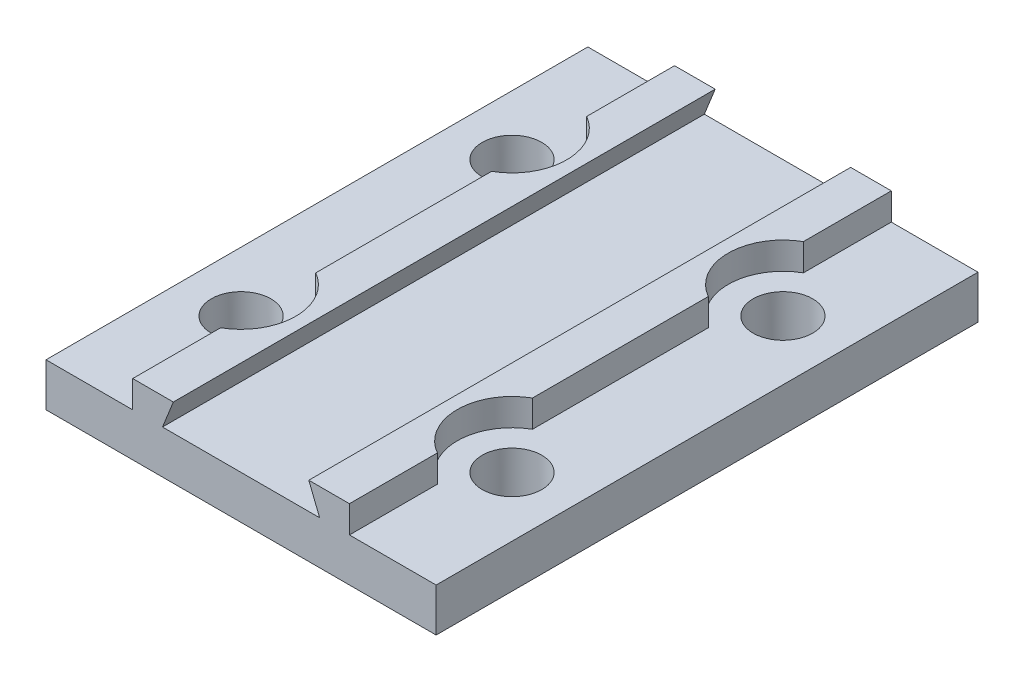
ISO-10303-21;
HEADER;
FILE_DESCRIPTION(('STEP AP214'),'2;1');
FILE_NAME('part.step','',(''),(''),'','','');
FILE_SCHEMA(('AUTOMOTIVE_DESIGN { 1 0 10303 214 1 1 1 1 }'));
ENDSEC;
DATA;
#1=APPLICATION_CONTEXT('core data for automotive mechanical design processes');
#2=APPLICATION_PROTOCOL_DEFINITION('international standard','automotive_design',2000,#1);
#3=PRODUCT_CONTEXT('',#1,'mechanical');
#4=PRODUCT('Part','Part','',(#3));
#5=PRODUCT_RELATED_PRODUCT_CATEGORY('part','',(#4));
#6=PRODUCT_DEFINITION_FORMATION('','',#4);
#7=PRODUCT_DEFINITION_CONTEXT('part definition',#1,'design');
#8=PRODUCT_DEFINITION('design','',#6,#7);
#9=PRODUCT_DEFINITION_SHAPE('','',#8);
#10=(LENGTH_UNIT() NAMED_UNIT(*) SI_UNIT(.MILLI.,.METRE.));
#11=(NAMED_UNIT(*) PLANE_ANGLE_UNIT() SI_UNIT($,.RADIAN.));
#12=(NAMED_UNIT(*) SI_UNIT($,.STERADIAN.) SOLID_ANGLE_UNIT());
#13=UNCERTAINTY_MEASURE_WITH_UNIT(LENGTH_MEASURE(1.E-05),#10,'distance_accuracy_value','');
#14=(GEOMETRIC_REPRESENTATION_CONTEXT(3) GLOBAL_UNCERTAINTY_ASSIGNED_CONTEXT((#13)) GLOBAL_UNIT_ASSIGNED_CONTEXT((#10,
#11,#12)) REPRESENTATION_CONTEXT('',''));
#15=CARTESIAN_POINT('',(0.,0.,0.));
#16=DIRECTION('',(0.,0.,1.));
#17=DIRECTION('',(1.,0.,0.));
#18=AXIS2_PLACEMENT_3D('',#15,#16,#17);
#19=CARTESIAN_POINT('',(10.,12.,25.));
#20=DIRECTION('',(-1.,0.,0.));
#21=DIRECTION('',(0.,0.,1.));
#22=AXIS2_PLACEMENT_3D('',#19,#20,#21);
#23=PLANE('',#22);
#24=DIRECTION('',(0.,-1.,0.));
#25=VECTOR('',#24,1.);
#26=CARTESIAN_POINT('',(10.,12.001,-8.11223291411224));
#27=LINE('',#26,#25);
#28=CARTESIAN_POINT('',(10.,9.5,-8.11223291411224));
#29=VERTEX_POINT('',#28);
#30=CARTESIAN_POINT('',(10.,12.,-8.11223291411224));
#31=VERTEX_POINT('',#30);
#32=EDGE_CURVE('E346',#29,#31,#27,.F.);
#33=ORIENTED_EDGE('',*,*,#32,.T.);
#34=DIRECTION('',(0.,0.,-1.));
#35=VECTOR('',#34,1.);
#36=CARTESIAN_POINT('',(10.,12.,25.));
#37=LINE('',#36,#35);
#38=CARTESIAN_POINT('',(10.,12.,8.11223291411224));
#39=VERTEX_POINT('',#38);
#40=EDGE_CURVE('E271',#39,#31,#37,.T.);
#41=ORIENTED_EDGE('',*,*,#40,.F.);
#42=DIRECTION('',(0.,-1.,0.));
#43=VECTOR('',#42,1.);
#44=CARTESIAN_POINT('',(10.,12.001,8.11223291411224));
#45=LINE('',#44,#43);
#46=CARTESIAN_POINT('',(10.,9.5,8.11223291411224));
#47=VERTEX_POINT('',#46);
#48=EDGE_CURVE('E183',#39,#47,#45,.T.);
#49=ORIENTED_EDGE('',*,*,#48,.T.);
#50=DIRECTION('',(0.,0.,1.));
#51=VECTOR('',#50,1.);
#52=CARTESIAN_POINT('',(10.,9.5,-25.));
#53=LINE('',#52,#51);
#54=EDGE_CURVE('E194',#29,#47,#53,.T.);
#55=ORIENTED_EDGE('',*,*,#54,.F.);
#56=EDGE_LOOP('',(#33,#41,#49,#55));
#57=FACE_BOUND('',#56,.T.);
#58=ADVANCED_FACE('F34',(#57),#23,.F.);
#59=DIRECTION('',(0.,-1.,0.));
#60=VECTOR('',#59,1.);
#61=CARTESIAN_POINT('',(10.,12.001,16.8877670858878));
#62=LINE('',#61,#60);
#63=CARTESIAN_POINT('',(10.,9.5,16.8877670858878));
#64=VERTEX_POINT('',#63);
#65=CARTESIAN_POINT('',(10.,12.,16.8877670858878));
#66=VERTEX_POINT('',#65);
#67=EDGE_CURVE('E172',#64,#66,#62,.F.);
#68=ORIENTED_EDGE('',*,*,#67,.T.);
#69=CARTESIAN_POINT('',(10.,12.,25.));
#70=VERTEX_POINT('',#69);
#71=EDGE_CURVE('E268',#70,#66,#37,.T.);
#72=ORIENTED_EDGE('',*,*,#71,.F.);
#73=DIRECTION('',(0.,-1.,0.));
#74=VECTOR('',#73,1.);
#75=CARTESIAN_POINT('',(10.,12.,25.));
#76=LINE('',#75,#74);
#77=CARTESIAN_POINT('',(10.,9.5,25.));
#78=VERTEX_POINT('',#77);
#79=EDGE_CURVE('E198',#70,#78,#76,.T.);
#80=ORIENTED_EDGE('',*,*,#79,.T.);
#81=EDGE_CURVE('E191',#64,#78,#53,.T.);
#82=ORIENTED_EDGE('',*,*,#81,.F.);
#83=EDGE_LOOP('',(#68,#72,#80,#82));
#84=FACE_BOUND('',#83,.T.);
#85=ADVANCED_FACE('F196',(#84),#23,.F.);
#86=CARTESIAN_POINT('',(-10.,12.,25.));
#87=DIRECTION('',(1.,0.,0.));
#88=DIRECTION('',(0.,0.,-1.));
#89=AXIS2_PLACEMENT_3D('',#86,#87,#88);
#90=PLANE('',#89);
#91=DIRECTION('',(0.,-1.,0.));
#92=VECTOR('',#91,1.);
#93=CARTESIAN_POINT('',(-10.,12.001,8.11223291411224));
#94=LINE('',#93,#92);
#95=CARTESIAN_POINT('',(-10.,9.5,8.11223291411224));
#96=VERTEX_POINT('',#95);
#97=CARTESIAN_POINT('',(-10.,12.,8.11223291411224));
#98=VERTEX_POINT('',#97);
#99=EDGE_CURVE('E363',#96,#98,#94,.F.);
#100=ORIENTED_EDGE('',*,*,#99,.T.);
#101=DIRECTION('',(0.,0.,1.));
#102=VECTOR('',#101,1.);
#103=CARTESIAN_POINT('',(-10.,12.,25.));
#104=LINE('',#103,#102);
#105=CARTESIAN_POINT('',(-10.,12.,-8.11223291411224));
#106=VERTEX_POINT('',#105);
#107=EDGE_CURVE('E280',#106,#98,#104,.T.);
#108=ORIENTED_EDGE('',*,*,#107,.F.);
#109=DIRECTION('',(0.,-1.,0.));
#110=VECTOR('',#109,1.);
#111=CARTESIAN_POINT('',(-10.,12.001,-8.11223291411224));
#112=LINE('',#111,#110);
#113=CARTESIAN_POINT('',(-10.,9.5,-8.11223291411224));
#114=VERTEX_POINT('',#113);
#115=EDGE_CURVE('E370',#106,#114,#112,.T.);
#116=ORIENTED_EDGE('',*,*,#115,.T.);
#117=DIRECTION('',(0.,0.,-1.));
#118=VECTOR('',#117,1.);
#119=CARTESIAN_POINT('',(-10.,9.5,-25.));
#120=LINE('',#119,#118);
#121=EDGE_CURVE('E236',#96,#114,#120,.T.);
#122=ORIENTED_EDGE('',*,*,#121,.F.);
#123=EDGE_LOOP('',(#100,#108,#116,#122));
#124=FACE_BOUND('',#123,.T.);
#125=ADVANCED_FACE('F329',(#124),#90,.F.);
#126=DIRECTION('',(0.,-1.,0.));
#127=VECTOR('',#126,1.);
#128=CARTESIAN_POINT('',(-10.,12.001,-16.8877670858878));
#129=LINE('',#128,#127);
#130=CARTESIAN_POINT('',(-10.,9.5,-16.8877670858878));
#131=VERTEX_POINT('',#130);
#132=CARTESIAN_POINT('',(-10.,12.,-16.8877670858878));
#133=VERTEX_POINT('',#132);
#134=EDGE_CURVE('E359',#131,#133,#129,.F.);
#135=ORIENTED_EDGE('',*,*,#134,.T.);
#136=CARTESIAN_POINT('',(-10.,12.,-25.));
#137=VERTEX_POINT('',#136);
#138=EDGE_CURVE('E276',#137,#133,#104,.T.);
#139=ORIENTED_EDGE('',*,*,#138,.F.);
#140=DIRECTION('',(0.,-1.,0.));
#141=VECTOR('',#140,1.);
#142=CARTESIAN_POINT('',(-10.,12.,-25.));
#143=LINE('',#142,#141);
#144=CARTESIAN_POINT('',(-10.,9.5,-25.));
#145=VERTEX_POINT('',#144);
#146=EDGE_CURVE('E288',#137,#145,#143,.T.);
#147=ORIENTED_EDGE('',*,*,#146,.T.);
#148=EDGE_CURVE('E222',#131,#145,#120,.T.);
#149=ORIENTED_EDGE('',*,*,#148,.F.);
#150=EDGE_LOOP('',(#135,#139,#147,#149));
#151=FACE_BOUND('',#150,.T.);
#152=ADVANCED_FACE('F333',(#151),#90,.F.);
#153=DIRECTION('',(0.,-1.,0.));
#154=VECTOR('',#153,1.);
#155=CARTESIAN_POINT('',(10.,12.001,-16.8877670858878));
#156=LINE('',#155,#154);
#157=CARTESIAN_POINT('',(10.,12.,-16.8877670858878));
#158=VERTEX_POINT('',#157);
#159=CARTESIAN_POINT('',(10.,9.5,-16.8877670858878));
#160=VERTEX_POINT('',#159);
#161=EDGE_CURVE('E343',#158,#160,#156,.T.);
#162=ORIENTED_EDGE('',*,*,#161,.T.);
#163=CARTESIAN_POINT('',(10.,9.5,-25.));
#164=VERTEX_POINT('',#163);
#165=EDGE_CURVE('E57',#164,#160,#53,.T.);
#166=ORIENTED_EDGE('',*,*,#165,.F.);
#167=DIRECTION('',(0.,-1.,0.));
#168=VECTOR('',#167,1.);
#169=CARTESIAN_POINT('',(10.,12.,-25.));
#170=LINE('',#169,#168);
#171=CARTESIAN_POINT('',(10.,12.,-25.));
#172=VERTEX_POINT('',#171);
#173=EDGE_CURVE('E291',#172,#164,#170,.T.);
#174=ORIENTED_EDGE('',*,*,#173,.F.);
#175=EDGE_CURVE('E267',#158,#172,#37,.T.);
#176=ORIENTED_EDGE('',*,*,#175,.F.);
#177=EDGE_LOOP('',(#162,#166,#174,#176));
#178=FACE_BOUND('',#177,.T.);
#179=ADVANCED_FACE('F325',(#178),#23,.F.);
#180=DIRECTION('',(0.,-1.,0.));
#181=VECTOR('',#180,1.);
#182=CARTESIAN_POINT('',(-10.,12.001,16.8877670858878));
#183=LINE('',#182,#181);
#184=CARTESIAN_POINT('',(-10.,12.,16.8877670858878));
#185=VERTEX_POINT('',#184);
#186=CARTESIAN_POINT('',(-10.,9.5,16.8877670858878));
#187=VERTEX_POINT('',#186);
#188=EDGE_CURVE('E360',#185,#187,#183,.T.);
#189=ORIENTED_EDGE('',*,*,#188,.T.);
#190=CARTESIAN_POINT('',(-10.,9.5,25.));
#191=VERTEX_POINT('',#190);
#192=EDGE_CURVE('E229',#191,#187,#120,.T.);
#193=ORIENTED_EDGE('',*,*,#192,.F.);
#194=DIRECTION('',(0.,-1.,0.));
#195=VECTOR('',#194,1.);
#196=CARTESIAN_POINT('',(-10.,12.,25.));
#197=LINE('',#196,#195);
#198=CARTESIAN_POINT('',(-10.,12.,25.));
#199=VERTEX_POINT('',#198);
#200=EDGE_CURVE('E285',#199,#191,#197,.T.);
#201=ORIENTED_EDGE('',*,*,#200,.F.);
#202=EDGE_CURVE('E275',#185,#199,#104,.T.);
#203=ORIENTED_EDGE('',*,*,#202,.F.);
#204=EDGE_LOOP('',(#189,#193,#201,#203));
#205=FACE_BOUND('',#204,.T.);
#206=ADVANCED_FACE('F332',(#205),#90,.F.);
#207=CARTESIAN_POINT('',(0.,12.,0.));
#208=DIRECTION('',(0.,-1.,0.));
#209=DIRECTION('',(0.,0.,-1.));
#210=AXIS2_PLACEMENT_3D('',#207,#208,#209);
#211=PLANE('',#210);
#212=CARTESIAN_POINT('',(12.5,12.,-12.5));
#213=DIRECTION('',(0.,-1.,0.));
#214=DIRECTION('',(0.,0.,-1.));
#215=AXIS2_PLACEMENT_3D('',#212,#213,#214);
#216=CIRCLE('',#215,5.05);
#217=EDGE_CURVE('E357',#31,#158,#216,.T.);
#218=ORIENTED_EDGE('',*,*,#217,.T.);
#219=ORIENTED_EDGE('',*,*,#175,.T.);
#220=DIRECTION('',(-1.,0.,0.));
#221=VECTOR('',#220,1.);
#222=CARTESIAN_POINT('',(-10.,12.,-25.));
#223=LINE('',#222,#221);
#224=CARTESIAN_POINT('',(6.25,12.,-25.));
#225=VERTEX_POINT('',#224);
#226=EDGE_CURVE('E272',#172,#225,#223,.T.);
#227=ORIENTED_EDGE('',*,*,#226,.T.);
#228=DIRECTION('',(0.,0.,1.));
#229=VECTOR('',#228,1.);
#230=CARTESIAN_POINT('',(6.25,12.,-25.001));
#231=LINE('',#230,#229);
#232=CARTESIAN_POINT('',(6.25,12.,25.));
#233=VERTEX_POINT('',#232);
#234=EDGE_CURVE('E257',#225,#233,#231,.T.);
#235=ORIENTED_EDGE('',*,*,#234,.T.);
#236=DIRECTION('',(1.,0.,0.));
#237=VECTOR('',#236,1.);
#238=CARTESIAN_POINT('',(-10.,12.,25.));
#239=LINE('',#238,#237);
#240=EDGE_CURVE('E279',#233,#70,#239,.T.);
#241=ORIENTED_EDGE('',*,*,#240,.T.);
#242=ORIENTED_EDGE('',*,*,#71,.T.);
#243=CARTESIAN_POINT('',(12.5,12.,12.5));
#244=DIRECTION('',(0.,-1.,0.));
#245=DIRECTION('',(0.,0.,-1.));
#246=AXIS2_PLACEMENT_3D('',#243,#244,#245);
#247=CIRCLE('',#246,5.05);
#248=EDGE_CURVE('E178',#66,#39,#247,.T.);
#249=ORIENTED_EDGE('',*,*,#248,.T.);
#250=ORIENTED_EDGE('',*,*,#40,.T.);
#251=EDGE_LOOP('',(#218,#219,#227,#235,#241,#242,#249,#250));
#252=FACE_BOUND('',#251,.T.);
#253=ADVANCED_FACE('F338',(#252),#211,.F.);
#254=CARTESIAN_POINT('',(-12.5,12.,12.5));
#255=DIRECTION('',(0.,-1.,0.));
#256=DIRECTION('',(0.,0.,-1.));
#257=AXIS2_PLACEMENT_3D('',#254,#255,#256);
#258=CIRCLE('',#257,5.05);
#259=EDGE_CURVE('E347',#98,#185,#258,.T.);
#260=ORIENTED_EDGE('',*,*,#259,.T.);
#261=ORIENTED_EDGE('',*,*,#202,.T.);
#262=CARTESIAN_POINT('',(-6.25,12.,25.));
#263=VERTEX_POINT('',#262);
#264=EDGE_CURVE('E281',#199,#263,#239,.T.);
#265=ORIENTED_EDGE('',*,*,#264,.T.);
#266=DIRECTION('',(0.,0.,1.));
#267=VECTOR('',#266,1.);
#268=CARTESIAN_POINT('',(-6.25,12.,-25.001));
#269=LINE('',#268,#267);
#270=CARTESIAN_POINT('',(-6.25,12.,-25.));
#271=VERTEX_POINT('',#270);
#272=EDGE_CURVE('E256',#271,#263,#269,.T.);
#273=ORIENTED_EDGE('',*,*,#272,.F.);
#274=EDGE_CURVE('E270',#271,#137,#223,.T.);
#275=ORIENTED_EDGE('',*,*,#274,.T.);
#276=ORIENTED_EDGE('',*,*,#138,.T.);
#277=CARTESIAN_POINT('',(-12.5,12.,-12.5));
#278=DIRECTION('',(0.,-1.,0.));
#279=DIRECTION('',(0.,0.,-1.));
#280=AXIS2_PLACEMENT_3D('',#277,#278,#279);
#281=CIRCLE('',#280,5.05);
#282=EDGE_CURVE('E376',#133,#106,#281,.T.);
#283=ORIENTED_EDGE('',*,*,#282,.T.);
#284=ORIENTED_EDGE('',*,*,#107,.T.);
#285=EDGE_LOOP('',(#260,#261,#265,#273,#275,#276,#283,#284));
#286=FACE_BOUND('',#285,.T.);
#287=ADVANCED_FACE('F407',(#286),#211,.F.);
#288=CARTESIAN_POINT('',(12.5,0.,12.5));
#289=DIRECTION('',(0.,1.,0.));
#290=DIRECTION('',(0.,0.,1.));
#291=AXIS2_PLACEMENT_3D('',#288,#289,#290);
#292=CYLINDRICAL_SURFACE('',#291,2.75);
#293=CARTESIAN_POINT('',(12.5,5.5,12.5));
#294=DIRECTION('',(0.,1.,0.));
#295=DIRECTION('',(0.,0.,1.));
#296=AXIS2_PLACEMENT_3D('',#293,#294,#295);
#297=CIRCLE('',#296,2.75);
#298=CARTESIAN_POINT('',(12.5,5.5,15.25));
#299=VERTEX_POINT('',#298);
#300=EDGE_CURVE('E200',#299,#299,#297,.F.);
#301=ORIENTED_EDGE('',*,*,#300,.T.);
#302=EDGE_LOOP('',(#301));
#303=FACE_BOUND('',#302,.T.);
#304=CARTESIAN_POINT('',(12.5,9.5,12.5));
#305=DIRECTION('',(0.,-1.,0.));
#306=DIRECTION('',(0.,0.,-1.));
#307=AXIS2_PLACEMENT_3D('',#304,#305,#306);
#308=CIRCLE('',#307,2.75);
#309=CARTESIAN_POINT('',(12.5,9.5,9.75));
#310=VERTEX_POINT('',#309);
#311=EDGE_CURVE('E293',#310,#310,#308,.T.);
#312=ORIENTED_EDGE('',*,*,#311,.F.);
#313=EDGE_LOOP('',(#312));
#314=FACE_BOUND('',#313,.T.);
#315=ADVANCED_FACE('F318',(#303,#314),#292,.F.);
#316=CARTESIAN_POINT('',(12.5,0.,-12.5));
#317=DIRECTION('',(0.,1.,0.));
#318=DIRECTION('',(0.,0.,1.));
#319=AXIS2_PLACEMENT_3D('',#316,#317,#318);
#320=CYLINDRICAL_SURFACE('',#319,2.75);
#321=CARTESIAN_POINT('',(12.5,5.5,-12.5));
#322=DIRECTION('',(0.,1.,0.));
#323=DIRECTION('',(0.,0.,1.));
#324=AXIS2_PLACEMENT_3D('',#321,#322,#323);
#325=CIRCLE('',#324,2.75);
#326=CARTESIAN_POINT('',(12.5,5.5,-9.75));
#327=VERTEX_POINT('',#326);
#328=EDGE_CURVE('E203',#327,#327,#325,.F.);
#329=ORIENTED_EDGE('',*,*,#328,.T.);
#330=EDGE_LOOP('',(#329));
#331=FACE_BOUND('',#330,.T.);
#332=CARTESIAN_POINT('',(12.5,9.5,-12.5));
#333=DIRECTION('',(0.,-1.,0.));
#334=DIRECTION('',(0.,0.,-1.));
#335=AXIS2_PLACEMENT_3D('',#332,#333,#334);
#336=CIRCLE('',#335,2.75);
#337=CARTESIAN_POINT('',(12.5,9.5,-15.25));
#338=VERTEX_POINT('',#337);
#339=EDGE_CURVE('E296',#338,#338,#336,.T.);
#340=ORIENTED_EDGE('',*,*,#339,.F.);
#341=EDGE_LOOP('',(#340));
#342=FACE_BOUND('',#341,.T.);
#343=ADVANCED_FACE('F308',(#331,#342),#320,.F.);
#344=CARTESIAN_POINT('',(-12.5,0.,-12.5));
#345=DIRECTION('',(0.,1.,0.));
#346=DIRECTION('',(0.,0.,1.));
#347=AXIS2_PLACEMENT_3D('',#344,#345,#346);
#348=CYLINDRICAL_SURFACE('',#347,2.75);
#349=CARTESIAN_POINT('',(-12.5,5.5,-12.5));
#350=DIRECTION('',(0.,1.,0.));
#351=DIRECTION('',(0.,0.,1.));
#352=AXIS2_PLACEMENT_3D('',#349,#350,#351);
#353=CIRCLE('',#352,2.75);
#354=CARTESIAN_POINT('',(-12.5,5.5,-9.75));
#355=VERTEX_POINT('',#354);
#356=EDGE_CURVE('E386',#355,#355,#353,.F.);
#357=ORIENTED_EDGE('',*,*,#356,.T.);
#358=EDGE_LOOP('',(#357));
#359=FACE_BOUND('',#358,.T.);
#360=CARTESIAN_POINT('',(-12.5,9.5,-12.5));
#361=DIRECTION('',(0.,-1.,0.));
#362=DIRECTION('',(0.,0.,-1.));
#363=AXIS2_PLACEMENT_3D('',#360,#361,#362);
#364=CIRCLE('',#363,2.75);
#365=CARTESIAN_POINT('',(-12.5,9.5,-15.25));
#366=VERTEX_POINT('',#365);
#367=EDGE_CURVE('E42',#366,#366,#364,.T.);
#368=ORIENTED_EDGE('',*,*,#367,.F.);
#369=EDGE_LOOP('',(#368));
#370=FACE_BOUND('',#369,.T.);
#371=ADVANCED_FACE('F305',(#359,#370),#348,.F.);
#372=CARTESIAN_POINT('',(-12.5,0.,12.5));
#373=DIRECTION('',(0.,1.,0.));
#374=DIRECTION('',(0.,0.,1.));
#375=AXIS2_PLACEMENT_3D('',#372,#373,#374);
#376=CYLINDRICAL_SURFACE('',#375,2.75);
#377=CARTESIAN_POINT('',(-12.5,5.5,12.5));
#378=DIRECTION('',(0.,1.,0.));
#379=DIRECTION('',(0.,0.,1.));
#380=AXIS2_PLACEMENT_3D('',#377,#378,#379);
#381=CIRCLE('',#380,2.75);
#382=CARTESIAN_POINT('',(-12.5,5.5,15.25));
#383=VERTEX_POINT('',#382);
#384=EDGE_CURVE('E37',#383,#383,#381,.F.);
#385=ORIENTED_EDGE('',*,*,#384,.T.);
#386=EDGE_LOOP('',(#385));
#387=FACE_BOUND('',#386,.T.);
#388=CARTESIAN_POINT('',(-12.5,9.5,12.5));
#389=DIRECTION('',(0.,-1.,0.));
#390=DIRECTION('',(0.,0.,-1.));
#391=AXIS2_PLACEMENT_3D('',#388,#389,#390);
#392=CIRCLE('',#391,2.75);
#393=CARTESIAN_POINT('',(-12.5,9.5,9.75000000000001));
#394=VERTEX_POINT('',#393);
#395=EDGE_CURVE('E11',#394,#394,#392,.T.);
#396=ORIENTED_EDGE('',*,*,#395,.F.);
#397=EDGE_LOOP('',(#396));
#398=FACE_BOUND('',#397,.T.);
#399=ADVANCED_FACE('F307',(#387,#398),#376,.F.);
#400=CARTESIAN_POINT('',(-10.,12.,-25.));
#401=DIRECTION('',(0.,0.,1.));
#402=DIRECTION('',(1.,0.,0.));
#403=AXIS2_PLACEMENT_3D('',#400,#401,#402);
#404=PLANE('',#403);
#405=DIRECTION('',(0.,1.,0.));
#406=VECTOR('',#405,1.);
#407=CARTESIAN_POINT('',(18.,9.5,-25.));
#408=LINE('',#407,#406);
#409=CARTESIAN_POINT('',(18.,5.5,-25.));
#410=VERTEX_POINT('',#409);
#411=CARTESIAN_POINT('',(18.,9.5,-25.));
#412=VERTEX_POINT('',#411);
#413=EDGE_CURVE('E207',#410,#412,#408,.T.);
#414=ORIENTED_EDGE('',*,*,#413,.F.);
#415=DIRECTION('',(1.,0.,0.));
#416=VECTOR('',#415,1.);
#417=CARTESIAN_POINT('',(-18.,5.5,-25.));
#418=LINE('',#417,#416);
#419=CARTESIAN_POINT('',(-18.,5.5,-25.));
#420=VERTEX_POINT('',#419);
#421=EDGE_CURVE('E49',#420,#410,#418,.T.);
#422=ORIENTED_EDGE('',*,*,#421,.F.);
#423=DIRECTION('',(0.,-1.,0.));
#424=VECTOR('',#423,1.);
#425=CARTESIAN_POINT('',(-18.,9.5,-25.));
#426=LINE('',#425,#424);
#427=CARTESIAN_POINT('',(-18.,9.5,-25.));
#428=VERTEX_POINT('',#427);
#429=EDGE_CURVE('E225',#428,#420,#426,.T.);
#430=ORIENTED_EDGE('',*,*,#429,.F.);
#431=DIRECTION('',(1.,0.,0.));
#432=VECTOR('',#431,1.);
#433=CARTESIAN_POINT('',(-18.,9.5,-25.));
#434=LINE('',#433,#432);
#435=EDGE_CURVE('E233',#428,#145,#434,.T.);
#436=ORIENTED_EDGE('',*,*,#435,.T.);
#437=ORIENTED_EDGE('',*,*,#146,.F.);
#438=ORIENTED_EDGE('',*,*,#274,.F.);
#439=DIRECTION('',(0.371390676354103,0.928476690885259,0.));
#440=VECTOR('',#439,1.);
#441=CARTESIAN_POINT('',(-7.25,9.5,-25.));
#442=LINE('',#441,#440);
#443=CARTESIAN_POINT('',(-7.25,9.5,-25.));
#444=VERTEX_POINT('',#443);
#445=EDGE_CURVE('E260',#444,#271,#442,.T.);
#446=ORIENTED_EDGE('',*,*,#445,.F.);
#447=DIRECTION('',(-1.,0.,0.));
#448=VECTOR('',#447,1.);
#449=CARTESIAN_POINT('',(0.,9.5,-25.));
#450=LINE('',#449,#448);
#451=CARTESIAN_POINT('',(7.25,9.5,-25.));
#452=VERTEX_POINT('',#451);
#453=EDGE_CURVE('E242',#452,#444,#450,.T.);
#454=ORIENTED_EDGE('',*,*,#453,.F.);
#455=DIRECTION('',(0.371390676354104,-0.928476690885259,0.));
#456=VECTOR('',#455,1.);
#457=CARTESIAN_POINT('',(6.25,12.,-25.));
#458=LINE('',#457,#456);
#459=EDGE_CURVE('E245',#225,#452,#458,.T.);
#460=ORIENTED_EDGE('',*,*,#459,.F.);
#461=ORIENTED_EDGE('',*,*,#226,.F.);
#462=ORIENTED_EDGE('',*,*,#173,.T.);
#463=DIRECTION('',(-1.,0.,0.));
#464=VECTOR('',#463,1.);
#465=CARTESIAN_POINT('',(18.,9.5,-25.));
#466=LINE('',#465,#464);
#467=EDGE_CURVE('E220',#412,#164,#466,.T.);
#468=ORIENTED_EDGE('',*,*,#467,.F.);
#469=EDGE_LOOP('',(#414,#422,#430,#436,#437,#438,#446,#454,#460,#461,#462,#468));
#470=FACE_BOUND('',#469,.T.);
#471=ADVANCED_FACE('F315',(#470),#404,.F.);
#472=CARTESIAN_POINT('',(-10.,12.,25.));
#473=DIRECTION('',(0.,0.,-1.));
#474=DIRECTION('',(-1.,0.,0.));
#475=AXIS2_PLACEMENT_3D('',#472,#473,#474);
#476=PLANE('',#475);
#477=DIRECTION('',(0.,1.,0.));
#478=VECTOR('',#477,1.);
#479=CARTESIAN_POINT('',(-18.,9.5,25.));
#480=LINE('',#479,#478);
#481=CARTESIAN_POINT('',(-18.,5.5,25.));
#482=VERTEX_POINT('',#481);
#483=CARTESIAN_POINT('',(-18.,9.5,25.));
#484=VERTEX_POINT('',#483);
#485=EDGE_CURVE('E228',#482,#484,#480,.T.);
#486=ORIENTED_EDGE('',*,*,#485,.F.);
#487=DIRECTION('',(-1.,0.,0.));
#488=VECTOR('',#487,1.);
#489=CARTESIAN_POINT('',(-18.,5.5,25.));
#490=LINE('',#489,#488);
#491=CARTESIAN_POINT('',(18.,5.5,25.));
#492=VERTEX_POINT('',#491);
#493=EDGE_CURVE('E381',#492,#482,#490,.T.);
#494=ORIENTED_EDGE('',*,*,#493,.F.);
#495=DIRECTION('',(0.,-1.,0.));
#496=VECTOR('',#495,1.);
#497=CARTESIAN_POINT('',(18.,9.5,25.));
#498=LINE('',#497,#496);
#499=CARTESIAN_POINT('',(18.,9.5,25.));
#500=VERTEX_POINT('',#499);
#501=EDGE_CURVE('E214',#500,#492,#498,.T.);
#502=ORIENTED_EDGE('',*,*,#501,.F.);
#503=DIRECTION('',(-1.,0.,0.));
#504=VECTOR('',#503,1.);
#505=CARTESIAN_POINT('',(18.,9.5,25.));
#506=LINE('',#505,#504);
#507=EDGE_CURVE('E218',#500,#78,#506,.T.);
#508=ORIENTED_EDGE('',*,*,#507,.T.);
#509=ORIENTED_EDGE('',*,*,#79,.F.);
#510=ORIENTED_EDGE('',*,*,#240,.F.);
#511=DIRECTION('',(-0.371390676354104,0.928476690885259,0.));
#512=VECTOR('',#511,1.);
#513=CARTESIAN_POINT('',(6.25,12.,25.));
#514=LINE('',#513,#512);
#515=CARTESIAN_POINT('',(7.25,9.5,25.));
#516=VERTEX_POINT('',#515);
#517=EDGE_CURVE('E254',#516,#233,#514,.T.);
#518=ORIENTED_EDGE('',*,*,#517,.F.);
#519=DIRECTION('',(1.,0.,0.));
#520=VECTOR('',#519,1.);
#521=CARTESIAN_POINT('',(0.,9.5,25.));
#522=LINE('',#521,#520);
#523=CARTESIAN_POINT('',(-7.25,9.5,25.));
#524=VERTEX_POINT('',#523);
#525=EDGE_CURVE('E251',#524,#516,#522,.T.);
#526=ORIENTED_EDGE('',*,*,#525,.F.);
#527=DIRECTION('',(-0.371390676354103,-0.928476690885259,0.));
#528=VECTOR('',#527,1.);
#529=CARTESIAN_POINT('',(-7.25,9.5,25.));
#530=LINE('',#529,#528);
#531=EDGE_CURVE('E248',#263,#524,#530,.T.);
#532=ORIENTED_EDGE('',*,*,#531,.F.);
#533=ORIENTED_EDGE('',*,*,#264,.F.);
#534=ORIENTED_EDGE('',*,*,#200,.T.);
#535=DIRECTION('',(1.,0.,0.));
#536=VECTOR('',#535,1.);
#537=CARTESIAN_POINT('',(-18.,9.5,25.));
#538=LINE('',#537,#536);
#539=EDGE_CURVE('E239',#484,#191,#538,.T.);
#540=ORIENTED_EDGE('',*,*,#539,.F.);
#541=EDGE_LOOP('',(#486,#494,#502,#508,#509,#510,#518,#526,#532,#533,#534,#540));
#542=FACE_BOUND('',#541,.T.);
#543=ADVANCED_FACE('F430',(#542),#476,.F.);
#544=CARTESIAN_POINT('',(6.25,12.,-25.001));
#545=DIRECTION('',(0.928476690885259,0.371390676354104,0.));
#546=DIRECTION('',(-0.371390676354104,0.928476690885259,0.));
#547=AXIS2_PLACEMENT_3D('',#544,#545,#546);
#548=PLANE('',#547);
#549=ORIENTED_EDGE('',*,*,#459,.T.);
#550=DIRECTION('',(0.,0.,1.));
#551=VECTOR('',#550,1.);
#552=CARTESIAN_POINT('',(7.25,9.5,-25.001));
#553=LINE('',#552,#551);
#554=EDGE_CURVE('E261',#452,#516,#553,.T.);
#555=ORIENTED_EDGE('',*,*,#554,.T.);
#556=ORIENTED_EDGE('',*,*,#517,.T.);
#557=ORIENTED_EDGE('',*,*,#234,.F.);
#558=EDGE_LOOP('',(#549,#555,#556,#557));
#559=FACE_BOUND('',#558,.T.);
#560=ADVANCED_FACE('F426',(#559),#548,.F.);
#561=CARTESIAN_POINT('',(0.,9.5,-25.001));
#562=DIRECTION('',(0.,-1.,0.));
#563=DIRECTION('',(0.,0.,-1.));
#564=AXIS2_PLACEMENT_3D('',#561,#562,#563);
#565=PLANE('',#564);
#566=ORIENTED_EDGE('',*,*,#453,.T.);
#567=DIRECTION('',(0.,0.,1.));
#568=VECTOR('',#567,1.);
#569=CARTESIAN_POINT('',(-7.25,9.5,-25.001));
#570=LINE('',#569,#568);
#571=EDGE_CURVE('E263',#444,#524,#570,.T.);
#572=ORIENTED_EDGE('',*,*,#571,.T.);
#573=ORIENTED_EDGE('',*,*,#525,.T.);
#574=ORIENTED_EDGE('',*,*,#554,.F.);
#575=EDGE_LOOP('',(#566,#572,#573,#574));
#576=FACE_BOUND('',#575,.T.);
#577=ADVANCED_FACE('F429',(#576),#565,.F.);
#578=CARTESIAN_POINT('',(-7.25,9.5,-25.001));
#579=DIRECTION('',(-0.928476690885259,0.371390676354103,0.));
#580=DIRECTION('',(-0.371390676354103,-0.928476690885259,0.));
#581=AXIS2_PLACEMENT_3D('',#578,#579,#580);
#582=PLANE('',#581);
#583=ORIENTED_EDGE('',*,*,#445,.T.);
#584=ORIENTED_EDGE('',*,*,#272,.T.);
#585=ORIENTED_EDGE('',*,*,#531,.T.);
#586=ORIENTED_EDGE('',*,*,#571,.F.);
#587=EDGE_LOOP('',(#583,#584,#585,#586));
#588=FACE_BOUND('',#587,.T.);
#589=ADVANCED_FACE('F424',(#588),#582,.F.);
#590=CARTESIAN_POINT('',(-18.,9.5,-25.));
#591=DIRECTION('',(0.,-1.,0.));
#592=DIRECTION('',(0.,0.,-1.));
#593=AXIS2_PLACEMENT_3D('',#590,#591,#592);
#594=PLANE('',#593);
#595=CARTESIAN_POINT('',(-12.5,9.5,12.5));
#596=DIRECTION('',(0.,1.,0.));
#597=DIRECTION('',(0.,0.,1.));
#598=AXIS2_PLACEMENT_3D('',#595,#596,#597);
#599=CIRCLE('',#598,5.05);
#600=EDGE_CURVE('E352',#187,#96,#599,.T.);
#601=ORIENTED_EDGE('',*,*,#600,.T.);
#602=ORIENTED_EDGE('',*,*,#121,.T.);
#603=CARTESIAN_POINT('',(-12.5,9.5,-12.5));
#604=DIRECTION('',(0.,1.,0.));
#605=DIRECTION('',(0.,0.,1.));
#606=AXIS2_PLACEMENT_3D('',#603,#604,#605);
#607=CIRCLE('',#606,5.05);
#608=EDGE_CURVE('E373',#114,#131,#607,.T.);
#609=ORIENTED_EDGE('',*,*,#608,.T.);
#610=ORIENTED_EDGE('',*,*,#148,.T.);
#611=ORIENTED_EDGE('',*,*,#435,.F.);
#612=DIRECTION('',(0.,0.,-1.));
#613=VECTOR('',#612,1.);
#614=CARTESIAN_POINT('',(-18.,9.5,-25.));
#615=LINE('',#614,#613);
#616=EDGE_CURVE('E231',#484,#428,#615,.T.);
#617=ORIENTED_EDGE('',*,*,#616,.F.);
#618=ORIENTED_EDGE('',*,*,#539,.T.);
#619=ORIENTED_EDGE('',*,*,#192,.T.);
#620=EDGE_LOOP('',(#601,#602,#609,#610,#611,#617,#618,#619));
#621=FACE_BOUND('',#620,.T.);
#622=ORIENTED_EDGE('',*,*,#367,.T.);
#623=EDGE_LOOP('',(#622));
#624=FACE_BOUND('',#623,.T.);
#625=ORIENTED_EDGE('',*,*,#395,.T.);
#626=EDGE_LOOP('',(#625));
#627=FACE_BOUND('',#626,.T.);
#628=ADVANCED_FACE('F302',(#621,#624,#627),#594,.F.);
#629=CARTESIAN_POINT('',(-18.,0.,0.));
#630=DIRECTION('',(-1.,0.,0.));
#631=DIRECTION('',(0.,0.,1.));
#632=AXIS2_PLACEMENT_3D('',#629,#630,#631);
#633=PLANE('',#632);
#634=DIRECTION('',(0.,0.,-1.));
#635=VECTOR('',#634,1.);
#636=CARTESIAN_POINT('',(-18.,5.5,-25.));
#637=LINE('',#636,#635);
#638=EDGE_CURVE('E383',#482,#420,#637,.T.);
#639=ORIENTED_EDGE('',*,*,#638,.F.);
#640=ORIENTED_EDGE('',*,*,#485,.T.);
#641=ORIENTED_EDGE('',*,*,#616,.T.);
#642=ORIENTED_EDGE('',*,*,#429,.T.);
#643=EDGE_LOOP('',(#639,#640,#641,#642));
#644=FACE_BOUND('',#643,.T.);
#645=ADVANCED_FACE('F412',(#644),#633,.T.);
#646=CARTESIAN_POINT('',(18.,9.5,-25.));
#647=DIRECTION('',(0.,-1.,0.));
#648=DIRECTION('',(0.,0.,-1.));
#649=AXIS2_PLACEMENT_3D('',#646,#647,#648);
#650=PLANE('',#649);
#651=CARTESIAN_POINT('',(12.5,9.5,-12.5));
#652=DIRECTION('',(0.,1.,0.));
#653=DIRECTION('',(0.,0.,1.));
#654=AXIS2_PLACEMENT_3D('',#651,#652,#653);
#655=CIRCLE('',#654,5.05);
#656=EDGE_CURVE('E349',#160,#29,#655,.T.);
#657=ORIENTED_EDGE('',*,*,#656,.T.);
#658=ORIENTED_EDGE('',*,*,#54,.T.);
#659=CARTESIAN_POINT('',(12.5,9.5,12.5));
#660=DIRECTION('',(0.,1.,0.));
#661=DIRECTION('',(0.,0.,1.));
#662=AXIS2_PLACEMENT_3D('',#659,#660,#661);
#663=CIRCLE('',#662,5.05);
#664=EDGE_CURVE('E175',#47,#64,#663,.T.);
#665=ORIENTED_EDGE('',*,*,#664,.T.);
#666=ORIENTED_EDGE('',*,*,#81,.T.);
#667=ORIENTED_EDGE('',*,*,#507,.F.);
#668=DIRECTION('',(0.,0.,1.));
#669=VECTOR('',#668,1.);
#670=CARTESIAN_POINT('',(18.,9.5,-25.));
#671=LINE('',#670,#669);
#672=EDGE_CURVE('E209',#412,#500,#671,.T.);
#673=ORIENTED_EDGE('',*,*,#672,.F.);
#674=ORIENTED_EDGE('',*,*,#467,.T.);
#675=ORIENTED_EDGE('',*,*,#165,.T.);
#676=EDGE_LOOP('',(#657,#658,#665,#666,#667,#673,#674,#675));
#677=FACE_BOUND('',#676,.T.);
#678=ORIENTED_EDGE('',*,*,#311,.T.);
#679=EDGE_LOOP('',(#678));
#680=FACE_BOUND('',#679,.T.);
#681=ORIENTED_EDGE('',*,*,#339,.T.);
#682=EDGE_LOOP('',(#681));
#683=FACE_BOUND('',#682,.T.);
#684=ADVANCED_FACE('F188',(#677,#680,#683),#650,.F.);
#685=CARTESIAN_POINT('',(18.,0.,0.));
#686=DIRECTION('',(-1.,0.,0.));
#687=DIRECTION('',(0.,0.,1.));
#688=AXIS2_PLACEMENT_3D('',#685,#686,#687);
#689=PLANE('',#688);
#690=ORIENTED_EDGE('',*,*,#501,.T.);
#691=DIRECTION('',(0.,0.,1.));
#692=VECTOR('',#691,1.);
#693=CARTESIAN_POINT('',(18.,5.5,-25.));
#694=LINE('',#693,#692);
#695=EDGE_CURVE('E379',#410,#492,#694,.T.);
#696=ORIENTED_EDGE('',*,*,#695,.F.);
#697=ORIENTED_EDGE('',*,*,#413,.T.);
#698=ORIENTED_EDGE('',*,*,#672,.T.);
#699=EDGE_LOOP('',(#690,#696,#697,#698));
#700=FACE_BOUND('',#699,.T.);
#701=ADVANCED_FACE('F395',(#700),#689,.F.);
#702=CARTESIAN_POINT('',(0.,5.5,0.));
#703=DIRECTION('',(0.,1.,0.));
#704=DIRECTION('',(0.,0.,1.));
#705=AXIS2_PLACEMENT_3D('',#702,#703,#704);
#706=PLANE('',#705);
#707=ORIENTED_EDGE('',*,*,#328,.F.);
#708=EDGE_LOOP('',(#707));
#709=FACE_BOUND('',#708,.T.);
#710=ORIENTED_EDGE('',*,*,#384,.F.);
#711=EDGE_LOOP('',(#710));
#712=FACE_BOUND('',#711,.T.);
#713=ORIENTED_EDGE('',*,*,#695,.T.);
#714=ORIENTED_EDGE('',*,*,#493,.T.);
#715=ORIENTED_EDGE('',*,*,#638,.T.);
#716=ORIENTED_EDGE('',*,*,#421,.T.);
#717=EDGE_LOOP('',(#713,#714,#715,#716));
#718=FACE_BOUND('',#717,.T.);
#719=ORIENTED_EDGE('',*,*,#356,.F.);
#720=EDGE_LOOP('',(#719));
#721=FACE_BOUND('',#720,.T.);
#722=ORIENTED_EDGE('',*,*,#300,.F.);
#723=EDGE_LOOP('',(#722));
#724=FACE_BOUND('',#723,.T.);
#725=ADVANCED_FACE('F391',(#709,#712,#718,#721,#724),#706,.F.);
#726=CARTESIAN_POINT('',(-12.5,12.001,12.5));
#727=DIRECTION('',(0.,-1.,0.));
#728=DIRECTION('',(0.,0.,-1.));
#729=AXIS2_PLACEMENT_3D('',#726,#727,#728);
#730=CYLINDRICAL_SURFACE('',#729,5.05);
#731=ORIENTED_EDGE('',*,*,#600,.F.);
#732=ORIENTED_EDGE('',*,*,#188,.F.);
#733=ORIENTED_EDGE('',*,*,#259,.F.);
#734=ORIENTED_EDGE('',*,*,#99,.F.);
#735=EDGE_LOOP('',(#731,#732,#733,#734));
#736=FACE_BOUND('',#735,.T.);
#737=ADVANCED_FACE('F394',(#736),#730,.F.);
#738=CARTESIAN_POINT('',(-12.5,12.001,-12.5));
#739=DIRECTION('',(0.,-1.,0.));
#740=DIRECTION('',(0.,0.,-1.));
#741=AXIS2_PLACEMENT_3D('',#738,#739,#740);
#742=CYLINDRICAL_SURFACE('',#741,5.05);
#743=ORIENTED_EDGE('',*,*,#282,.F.);
#744=ORIENTED_EDGE('',*,*,#134,.F.);
#745=ORIENTED_EDGE('',*,*,#608,.F.);
#746=ORIENTED_EDGE('',*,*,#115,.F.);
#747=EDGE_LOOP('',(#743,#744,#745,#746));
#748=FACE_BOUND('',#747,.T.);
#749=ADVANCED_FACE('F476',(#748),#742,.F.);
#750=CARTESIAN_POINT('',(12.5,12.001,-12.5));
#751=DIRECTION('',(0.,-1.,0.));
#752=DIRECTION('',(0.,0.,-1.));
#753=AXIS2_PLACEMENT_3D('',#750,#751,#752);
#754=CYLINDRICAL_SURFACE('',#753,5.05);
#755=ORIENTED_EDGE('',*,*,#656,.F.);
#756=ORIENTED_EDGE('',*,*,#161,.F.);
#757=ORIENTED_EDGE('',*,*,#217,.F.);
#758=ORIENTED_EDGE('',*,*,#32,.F.);
#759=EDGE_LOOP('',(#755,#756,#757,#758));
#760=FACE_BOUND('',#759,.T.);
#761=ADVANCED_FACE('F474',(#760),#754,.F.);
#762=CARTESIAN_POINT('',(12.5,12.001,12.5));
#763=DIRECTION('',(0.,-1.,0.));
#764=DIRECTION('',(0.,0.,-1.));
#765=AXIS2_PLACEMENT_3D('',#762,#763,#764);
#766=CYLINDRICAL_SURFACE('',#765,5.05);
#767=ORIENTED_EDGE('',*,*,#248,.F.);
#768=ORIENTED_EDGE('',*,*,#67,.F.);
#769=ORIENTED_EDGE('',*,*,#664,.F.);
#770=ORIENTED_EDGE('',*,*,#48,.F.);
#771=EDGE_LOOP('',(#767,#768,#769,#770));
#772=FACE_BOUND('',#771,.T.);
#773=ADVANCED_FACE('F174',(#772),#766,.F.);
#774=CLOSED_SHELL('',(#58,#85,#125,#152,#179,#206,#253,#287,#315,#343,#371,#399,#471,#543,#560,
#577,#589,#628,#645,#684,#701,#725,#737,#749,#761,#773));
#775=MANIFOLD_SOLID_BREP('B2',#774);
#776=ADVANCED_BREP_SHAPE_REPRESENTATION('',(#18,#775),#14);
#777=SHAPE_DEFINITION_REPRESENTATION(#9,#776);
ENDSEC;
END-ISO-10303-21;
